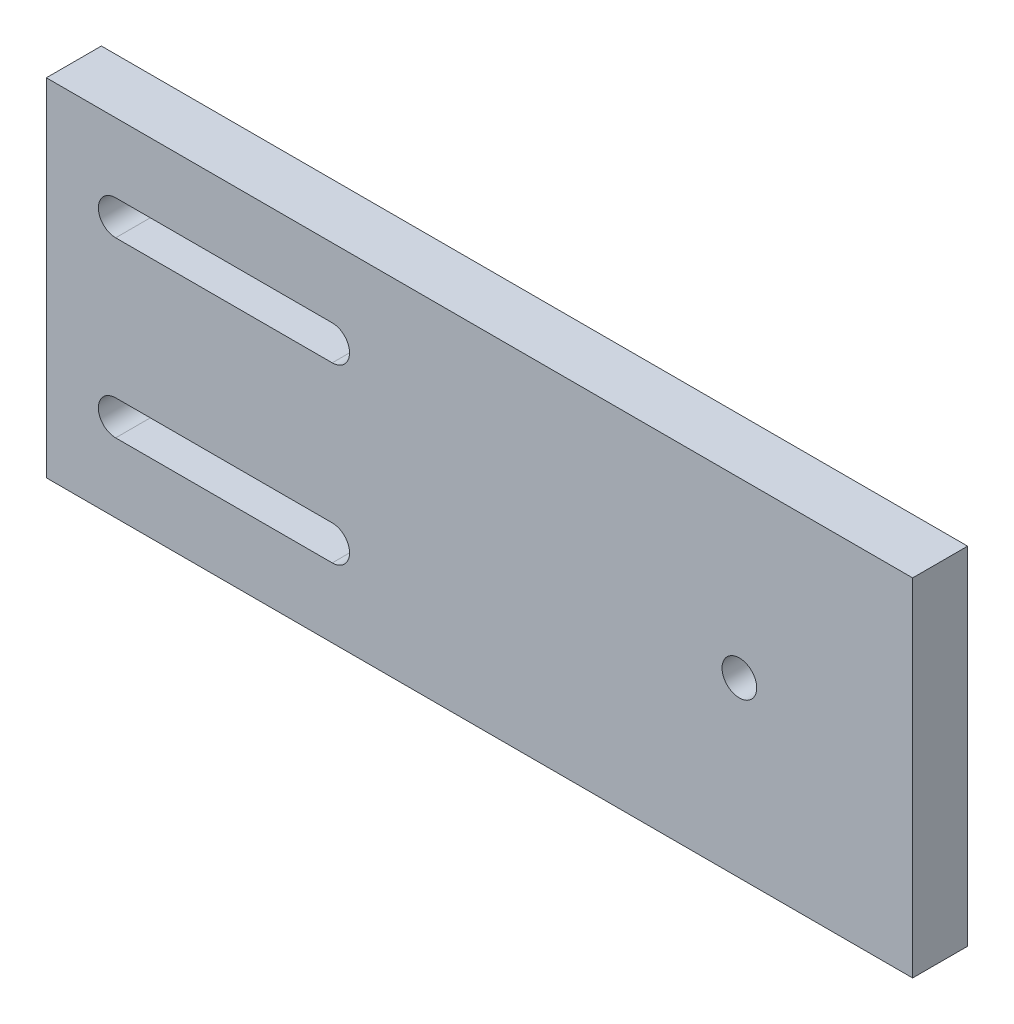
ISO-10303-21;
HEADER;
FILE_DESCRIPTION(('STEP AP214'),'2;1');
FILE_NAME('part.step','',(''),(''),'','','');
FILE_SCHEMA(('AUTOMOTIVE_DESIGN { 1 0 10303 214 1 1 1 1 }'));
ENDSEC;
DATA;
#1=APPLICATION_CONTEXT('core data for automotive mechanical design processes');
#2=APPLICATION_PROTOCOL_DEFINITION('international standard','automotive_design',2000,#1);
#3=PRODUCT_CONTEXT('',#1,'mechanical');
#4=PRODUCT('Part','Part','',(#3));
#5=PRODUCT_RELATED_PRODUCT_CATEGORY('part','',(#4));
#6=PRODUCT_DEFINITION_FORMATION('','',#4);
#7=PRODUCT_DEFINITION_CONTEXT('part definition',#1,'design');
#8=PRODUCT_DEFINITION('design','',#6,#7);
#9=PRODUCT_DEFINITION_SHAPE('','',#8);
#10=(LENGTH_UNIT() NAMED_UNIT(*) SI_UNIT(.MILLI.,.METRE.));
#11=(NAMED_UNIT(*) PLANE_ANGLE_UNIT() SI_UNIT($,.RADIAN.));
#12=(NAMED_UNIT(*) SI_UNIT($,.STERADIAN.) SOLID_ANGLE_UNIT());
#13=UNCERTAINTY_MEASURE_WITH_UNIT(LENGTH_MEASURE(1.E-05),#10,'distance_accuracy_value','');
#14=(GEOMETRIC_REPRESENTATION_CONTEXT(3) GLOBAL_UNCERTAINTY_ASSIGNED_CONTEXT((#13)) GLOBAL_UNIT_ASSIGNED_CONTEXT((#10,
#11,#12)) REPRESENTATION_CONTEXT('',''));
#15=CARTESIAN_POINT('',(0.,0.,0.));
#16=DIRECTION('',(0.,0.,1.));
#17=DIRECTION('',(1.,0.,0.));
#18=AXIS2_PLACEMENT_3D('',#15,#16,#17);
#19=CARTESIAN_POINT('',(0.,0.,6.35));
#20=DIRECTION('',(0.,0.,-1.));
#21=DIRECTION('',(-1.,0.,0.));
#22=AXIS2_PLACEMENT_3D('',#19,#20,#21);
#23=PLANE('',#22);
#24=CARTESIAN_POINT('',(8.,30.,6.35));
#25=DIRECTION('',(0.,0.,1.));
#26=DIRECTION('',(1.,0.,0.));
#27=AXIS2_PLACEMENT_3D('',#24,#25,#26);
#28=CIRCLE('',#27,2.);
#29=CARTESIAN_POINT('',(8.,32.,6.35));
#30=VERTEX_POINT('',#29);
#31=CARTESIAN_POINT('',(8.,28.,6.35));
#32=VERTEX_POINT('',#31);
#33=EDGE_CURVE('E165',#30,#32,#28,.T.);
#34=ORIENTED_EDGE('',*,*,#33,.F.);
#35=DIRECTION('',(-1.,0.,0.));
#36=VECTOR('',#35,1.);
#37=CARTESIAN_POINT('',(8.,32.,6.35));
#38=LINE('',#37,#36);
#39=CARTESIAN_POINT('',(33.,32.,6.35));
#40=VERTEX_POINT('',#39);
#41=EDGE_CURVE('E173',#40,#30,#38,.T.);
#42=ORIENTED_EDGE('',*,*,#41,.F.);
#43=CARTESIAN_POINT('',(33.,30.,6.35));
#44=DIRECTION('',(0.,0.,1.));
#45=DIRECTION('',(-1.,0.,0.));
#46=AXIS2_PLACEMENT_3D('',#43,#44,#45);
#47=CIRCLE('',#46,2.);
#48=CARTESIAN_POINT('',(33.,28.,6.35));
#49=VERTEX_POINT('',#48);
#50=EDGE_CURVE('E170',#49,#40,#47,.T.);
#51=ORIENTED_EDGE('',*,*,#50,.F.);
#52=DIRECTION('',(1.,0.,0.));
#53=VECTOR('',#52,1.);
#54=CARTESIAN_POINT('',(8.,28.,6.35));
#55=LINE('',#54,#53);
#56=EDGE_CURVE('E167',#32,#49,#55,.T.);
#57=ORIENTED_EDGE('',*,*,#56,.F.);
#58=EDGE_LOOP('',(#34,#42,#51,#57));
#59=FACE_BOUND('',#58,.T.);
#60=DIRECTION('',(0.,-1.,0.));
#61=VECTOR('',#60,1.);
#62=CARTESIAN_POINT('',(0.,0.,6.35));
#63=LINE('',#62,#61);
#64=CARTESIAN_POINT('',(0.,40.,6.35));
#65=VERTEX_POINT('',#64);
#66=CARTESIAN_POINT('',(0.,0.,6.35));
#67=VERTEX_POINT('',#66);
#68=EDGE_CURVE('E196',#65,#67,#63,.T.);
#69=ORIENTED_EDGE('',*,*,#68,.T.);
#70=DIRECTION('',(1.,0.,0.));
#71=VECTOR('',#70,1.);
#72=CARTESIAN_POINT('',(0.,0.,6.35));
#73=LINE('',#72,#71);
#74=CARTESIAN_POINT('',(100.,0.,6.35));
#75=VERTEX_POINT('',#74);
#76=EDGE_CURVE('E199',#67,#75,#73,.T.);
#77=ORIENTED_EDGE('',*,*,#76,.T.);
#78=DIRECTION('',(0.,1.,0.));
#79=VECTOR('',#78,1.);
#80=CARTESIAN_POINT('',(100.,0.,6.35));
#81=LINE('',#80,#79);
#82=CARTESIAN_POINT('',(100.,40.,6.35));
#83=VERTEX_POINT('',#82);
#84=EDGE_CURVE('E202',#75,#83,#81,.T.);
#85=ORIENTED_EDGE('',*,*,#84,.T.);
#86=DIRECTION('',(-1.,0.,0.));
#87=VECTOR('',#86,1.);
#88=CARTESIAN_POINT('',(0.,40.,6.35));
#89=LINE('',#88,#87);
#90=EDGE_CURVE('E204',#83,#65,#89,.T.);
#91=ORIENTED_EDGE('',*,*,#90,.T.);
#92=EDGE_LOOP('',(#69,#77,#85,#91));
#93=FACE_BOUND('',#92,.T.);
#94=CARTESIAN_POINT('',(8.,10.,6.35));
#95=DIRECTION('',(0.,0.,1.));
#96=DIRECTION('',(1.,0.,0.));
#97=AXIS2_PLACEMENT_3D('',#94,#95,#96);
#98=CIRCLE('',#97,2.);
#99=CARTESIAN_POINT('',(8.,12.,6.35));
#100=VERTEX_POINT('',#99);
#101=CARTESIAN_POINT('',(8.,8.,6.35));
#102=VERTEX_POINT('',#101);
#103=EDGE_CURVE('E126',#100,#102,#98,.T.);
#104=ORIENTED_EDGE('',*,*,#103,.F.);
#105=DIRECTION('',(-1.,0.,0.));
#106=VECTOR('',#105,1.);
#107=CARTESIAN_POINT('',(8.,12.,6.35));
#108=LINE('',#107,#106);
#109=CARTESIAN_POINT('',(33.,12.,6.35));
#110=VERTEX_POINT('',#109);
#111=EDGE_CURVE('E149',#110,#100,#108,.T.);
#112=ORIENTED_EDGE('',*,*,#111,.F.);
#113=CARTESIAN_POINT('',(33.,10.,6.35));
#114=DIRECTION('',(0.,0.,1.));
#115=DIRECTION('',(-1.,0.,0.));
#116=AXIS2_PLACEMENT_3D('',#113,#114,#115);
#117=CIRCLE('',#116,2.);
#118=CARTESIAN_POINT('',(33.,8.,6.35));
#119=VERTEX_POINT('',#118);
#120=EDGE_CURVE('E147',#119,#110,#117,.T.);
#121=ORIENTED_EDGE('',*,*,#120,.F.);
#122=DIRECTION('',(1.,0.,0.));
#123=VECTOR('',#122,1.);
#124=CARTESIAN_POINT('',(8.,8.,6.35));
#125=LINE('',#124,#123);
#126=EDGE_CURVE('E134',#102,#119,#125,.T.);
#127=ORIENTED_EDGE('',*,*,#126,.F.);
#128=EDGE_LOOP('',(#104,#112,#121,#127));
#129=FACE_BOUND('',#128,.T.);
#130=CARTESIAN_POINT('',(80.,20.,6.35));
#131=DIRECTION('',(0.,0.,1.));
#132=DIRECTION('',(1.,0.,0.));
#133=AXIS2_PLACEMENT_3D('',#130,#131,#132);
#134=CIRCLE('',#133,2.);
#135=CARTESIAN_POINT('',(82.,20.,6.35));
#136=VERTEX_POINT('',#135);
#137=EDGE_CURVE('E155',#136,#136,#134,.T.);
#138=ORIENTED_EDGE('',*,*,#137,.F.);
#139=EDGE_LOOP('',(#138));
#140=FACE_BOUND('',#139,.T.);
#141=ADVANCED_FACE('F37',(#59,#93,#129,#140),#23,.F.);
#142=CARTESIAN_POINT('',(0.,0.,0.));
#143=DIRECTION('',(0.,0.,-1.));
#144=DIRECTION('',(-1.,0.,0.));
#145=AXIS2_PLACEMENT_3D('',#142,#143,#144);
#146=PLANE('',#145);
#147=DIRECTION('',(-1.,0.,0.));
#148=VECTOR('',#147,1.);
#149=CARTESIAN_POINT('',(8.,12.,0.));
#150=LINE('',#149,#148);
#151=CARTESIAN_POINT('',(33.,12.,0.));
#152=VERTEX_POINT('',#151);
#153=CARTESIAN_POINT('',(8.,12.,0.));
#154=VERTEX_POINT('',#153);
#155=EDGE_CURVE('E135',#152,#154,#150,.T.);
#156=ORIENTED_EDGE('',*,*,#155,.T.);
#157=CARTESIAN_POINT('',(8.,10.,0.));
#158=DIRECTION('',(0.,0.,1.));
#159=DIRECTION('',(1.,0.,0.));
#160=AXIS2_PLACEMENT_3D('',#157,#158,#159);
#161=CIRCLE('',#160,2.);
#162=CARTESIAN_POINT('',(8.,8.,0.));
#163=VERTEX_POINT('',#162);
#164=EDGE_CURVE('E60',#154,#163,#161,.T.);
#165=ORIENTED_EDGE('',*,*,#164,.T.);
#166=DIRECTION('',(1.,0.,0.));
#167=VECTOR('',#166,1.);
#168=CARTESIAN_POINT('',(8.,8.,0.));
#169=LINE('',#168,#167);
#170=CARTESIAN_POINT('',(33.,8.,0.));
#171=VERTEX_POINT('',#170);
#172=EDGE_CURVE('E141',#163,#171,#169,.T.);
#173=ORIENTED_EDGE('',*,*,#172,.T.);
#174=CARTESIAN_POINT('',(33.,10.,0.));
#175=DIRECTION('',(0.,0.,1.));
#176=DIRECTION('',(-1.,0.,0.));
#177=AXIS2_PLACEMENT_3D('',#174,#175,#176);
#178=CIRCLE('',#177,2.);
#179=EDGE_CURVE('E157',#171,#152,#178,.T.);
#180=ORIENTED_EDGE('',*,*,#179,.T.);
#181=EDGE_LOOP('',(#156,#165,#173,#180));
#182=FACE_BOUND('',#181,.T.);
#183=DIRECTION('',(-1.,0.,0.));
#184=VECTOR('',#183,1.);
#185=CARTESIAN_POINT('',(8.,32.,0.));
#186=LINE('',#185,#184);
#187=CARTESIAN_POINT('',(33.,32.,0.));
#188=VERTEX_POINT('',#187);
#189=CARTESIAN_POINT('',(8.,32.,0.));
#190=VERTEX_POINT('',#189);
#191=EDGE_CURVE('E168',#188,#190,#186,.T.);
#192=ORIENTED_EDGE('',*,*,#191,.T.);
#193=CARTESIAN_POINT('',(8.,30.,0.));
#194=DIRECTION('',(0.,0.,1.));
#195=DIRECTION('',(1.,0.,0.));
#196=AXIS2_PLACEMENT_3D('',#193,#194,#195);
#197=CIRCLE('',#196,2.);
#198=CARTESIAN_POINT('',(8.,28.,0.));
#199=VERTEX_POINT('',#198);
#200=EDGE_CURVE('E142',#190,#199,#197,.T.);
#201=ORIENTED_EDGE('',*,*,#200,.T.);
#202=DIRECTION('',(1.,0.,0.));
#203=VECTOR('',#202,1.);
#204=CARTESIAN_POINT('',(8.,28.,0.));
#205=LINE('',#204,#203);
#206=CARTESIAN_POINT('',(33.,28.,0.));
#207=VERTEX_POINT('',#206);
#208=EDGE_CURVE('E178',#199,#207,#205,.T.);
#209=ORIENTED_EDGE('',*,*,#208,.T.);
#210=CARTESIAN_POINT('',(33.,30.,0.));
#211=DIRECTION('',(0.,0.,1.));
#212=DIRECTION('',(-1.,0.,0.));
#213=AXIS2_PLACEMENT_3D('',#210,#211,#212);
#214=CIRCLE('',#213,2.);
#215=EDGE_CURVE('E181',#207,#188,#214,.T.);
#216=ORIENTED_EDGE('',*,*,#215,.T.);
#217=EDGE_LOOP('',(#192,#201,#209,#216));
#218=FACE_BOUND('',#217,.T.);
#219=DIRECTION('',(0.,-1.,0.));
#220=VECTOR('',#219,1.);
#221=CARTESIAN_POINT('',(0.,0.,0.));
#222=LINE('',#221,#220);
#223=CARTESIAN_POINT('',(0.,40.,0.));
#224=VERTEX_POINT('',#223);
#225=CARTESIAN_POINT('',(0.,0.,0.));
#226=VERTEX_POINT('',#225);
#227=EDGE_CURVE('E195',#224,#226,#222,.T.);
#228=ORIENTED_EDGE('',*,*,#227,.F.);
#229=DIRECTION('',(-1.,0.,0.));
#230=VECTOR('',#229,1.);
#231=CARTESIAN_POINT('',(0.,40.,0.));
#232=LINE('',#231,#230);
#233=CARTESIAN_POINT('',(100.,40.,0.));
#234=VERTEX_POINT('',#233);
#235=EDGE_CURVE('E200',#234,#224,#232,.T.);
#236=ORIENTED_EDGE('',*,*,#235,.F.);
#237=DIRECTION('',(0.,1.,0.));
#238=VECTOR('',#237,1.);
#239=CARTESIAN_POINT('',(100.,0.,0.));
#240=LINE('',#239,#238);
#241=CARTESIAN_POINT('',(100.,0.,0.));
#242=VERTEX_POINT('',#241);
#243=EDGE_CURVE('E211',#242,#234,#240,.T.);
#244=ORIENTED_EDGE('',*,*,#243,.F.);
#245=DIRECTION('',(1.,0.,0.));
#246=VECTOR('',#245,1.);
#247=CARTESIAN_POINT('',(0.,0.,0.));
#248=LINE('',#247,#246);
#249=EDGE_CURVE('E209',#226,#242,#248,.T.);
#250=ORIENTED_EDGE('',*,*,#249,.F.);
#251=EDGE_LOOP('',(#228,#236,#244,#250));
#252=FACE_BOUND('',#251,.T.);
#253=CARTESIAN_POINT('',(80.,20.,0.));
#254=DIRECTION('',(0.,0.,1.));
#255=DIRECTION('',(1.,0.,0.));
#256=AXIS2_PLACEMENT_3D('',#253,#254,#255);
#257=CIRCLE('',#256,2.);
#258=CARTESIAN_POINT('',(82.,20.,0.));
#259=VERTEX_POINT('',#258);
#260=EDGE_CURVE('E310',#259,#259,#257,.T.);
#261=ORIENTED_EDGE('',*,*,#260,.T.);
#262=EDGE_LOOP('',(#261));
#263=FACE_BOUND('',#262,.T.);
#264=ADVANCED_FACE('F229',(#182,#218,#252,#263),#146,.T.);
#265=CARTESIAN_POINT('',(0.,0.,6.35));
#266=DIRECTION('',(1.,0.,0.));
#267=DIRECTION('',(0.,0.,-1.));
#268=AXIS2_PLACEMENT_3D('',#265,#266,#267);
#269=PLANE('',#268);
#270=ORIENTED_EDGE('',*,*,#227,.T.);
#271=DIRECTION('',(0.,0.,-1.));
#272=VECTOR('',#271,1.);
#273=CARTESIAN_POINT('',(0.,0.,6.35));
#274=LINE('',#273,#272);
#275=EDGE_CURVE('E11',#67,#226,#274,.T.);
#276=ORIENTED_EDGE('',*,*,#275,.F.);
#277=ORIENTED_EDGE('',*,*,#68,.F.);
#278=DIRECTION('',(0.,0.,-1.));
#279=VECTOR('',#278,1.);
#280=CARTESIAN_POINT('',(0.,40.,6.35));
#281=LINE('',#280,#279);
#282=EDGE_CURVE('E206',#65,#224,#281,.T.);
#283=ORIENTED_EDGE('',*,*,#282,.T.);
#284=EDGE_LOOP('',(#270,#276,#277,#283));
#285=FACE_BOUND('',#284,.T.);
#286=ADVANCED_FACE('F39',(#285),#269,.F.);
#287=CARTESIAN_POINT('',(0.,0.,6.35));
#288=DIRECTION('',(0.,1.,0.));
#289=DIRECTION('',(-1.,0.,0.));
#290=AXIS2_PLACEMENT_3D('',#287,#288,#289);
#291=PLANE('',#290);
#292=ORIENTED_EDGE('',*,*,#249,.T.);
#293=DIRECTION('',(0.,0.,-1.));
#294=VECTOR('',#293,1.);
#295=CARTESIAN_POINT('',(100.,0.,6.35));
#296=LINE('',#295,#294);
#297=EDGE_CURVE('E45',#75,#242,#296,.T.);
#298=ORIENTED_EDGE('',*,*,#297,.F.);
#299=ORIENTED_EDGE('',*,*,#76,.F.);
#300=ORIENTED_EDGE('',*,*,#275,.T.);
#301=EDGE_LOOP('',(#292,#298,#299,#300));
#302=FACE_BOUND('',#301,.T.);
#303=ADVANCED_FACE('F239',(#302),#291,.F.);
#304=CARTESIAN_POINT('',(100.,0.,6.35));
#305=DIRECTION('',(-1.,0.,0.));
#306=DIRECTION('',(0.,-1.,0.));
#307=AXIS2_PLACEMENT_3D('',#304,#305,#306);
#308=PLANE('',#307);
#309=ORIENTED_EDGE('',*,*,#243,.T.);
#310=DIRECTION('',(0.,0.,-1.));
#311=VECTOR('',#310,1.);
#312=CARTESIAN_POINT('',(100.,40.,6.35));
#313=LINE('',#312,#311);
#314=EDGE_CURVE('E216',#83,#234,#313,.T.);
#315=ORIENTED_EDGE('',*,*,#314,.F.);
#316=ORIENTED_EDGE('',*,*,#84,.F.);
#317=ORIENTED_EDGE('',*,*,#297,.T.);
#318=EDGE_LOOP('',(#309,#315,#316,#317));
#319=FACE_BOUND('',#318,.T.);
#320=ADVANCED_FACE('F223',(#319),#308,.F.);
#321=CARTESIAN_POINT('',(0.,40.,6.35));
#322=DIRECTION('',(0.,-1.,0.));
#323=DIRECTION('',(1.,0.,0.));
#324=AXIS2_PLACEMENT_3D('',#321,#322,#323);
#325=PLANE('',#324);
#326=ORIENTED_EDGE('',*,*,#235,.T.);
#327=ORIENTED_EDGE('',*,*,#282,.F.);
#328=ORIENTED_EDGE('',*,*,#90,.F.);
#329=ORIENTED_EDGE('',*,*,#314,.T.);
#330=EDGE_LOOP('',(#326,#327,#328,#329));
#331=FACE_BOUND('',#330,.T.);
#332=ADVANCED_FACE('F233',(#331),#325,.F.);
#333=CARTESIAN_POINT('',(8.,30.,6.35));
#334=DIRECTION('',(0.,0.,-1.));
#335=DIRECTION('',(-1.,0.,0.));
#336=AXIS2_PLACEMENT_3D('',#333,#334,#335);
#337=CYLINDRICAL_SURFACE('',#336,2.);
#338=ORIENTED_EDGE('',*,*,#200,.F.);
#339=DIRECTION('',(0.,0.,-1.));
#340=VECTOR('',#339,1.);
#341=CARTESIAN_POINT('',(8.,32.,6.35));
#342=LINE('',#341,#340);
#343=EDGE_CURVE('E175',#30,#190,#342,.T.);
#344=ORIENTED_EDGE('',*,*,#343,.F.);
#345=ORIENTED_EDGE('',*,*,#33,.T.);
#346=DIRECTION('',(0.,0.,-1.));
#347=VECTOR('',#346,1.);
#348=CARTESIAN_POINT('',(8.,28.,6.35));
#349=LINE('',#348,#347);
#350=EDGE_CURVE('E192',#32,#199,#349,.T.);
#351=ORIENTED_EDGE('',*,*,#350,.T.);
#352=EDGE_LOOP('',(#338,#344,#345,#351));
#353=FACE_BOUND('',#352,.T.);
#354=ADVANCED_FACE('F256',(#353),#337,.F.);
#355=CARTESIAN_POINT('',(8.,28.,6.35));
#356=DIRECTION('',(0.,1.,0.));
#357=DIRECTION('',(-1.,0.,0.));
#358=AXIS2_PLACEMENT_3D('',#355,#356,#357);
#359=PLANE('',#358);
#360=ORIENTED_EDGE('',*,*,#208,.F.);
#361=ORIENTED_EDGE('',*,*,#350,.F.);
#362=ORIENTED_EDGE('',*,*,#56,.T.);
#363=DIRECTION('',(0.,0.,-1.));
#364=VECTOR('',#363,1.);
#365=CARTESIAN_POINT('',(33.,28.,6.35));
#366=LINE('',#365,#364);
#367=EDGE_CURVE('E190',#49,#207,#366,.T.);
#368=ORIENTED_EDGE('',*,*,#367,.T.);
#369=EDGE_LOOP('',(#360,#361,#362,#368));
#370=FACE_BOUND('',#369,.T.);
#371=ADVANCED_FACE('F263',(#370),#359,.T.);
#372=CARTESIAN_POINT('',(33.,30.,6.35));
#373=DIRECTION('',(0.,0.,-1.));
#374=DIRECTION('',(-1.,0.,0.));
#375=AXIS2_PLACEMENT_3D('',#372,#373,#374);
#376=CYLINDRICAL_SURFACE('',#375,2.);
#377=ORIENTED_EDGE('',*,*,#215,.F.);
#378=ORIENTED_EDGE('',*,*,#367,.F.);
#379=ORIENTED_EDGE('',*,*,#50,.T.);
#380=DIRECTION('',(0.,0.,-1.));
#381=VECTOR('',#380,1.);
#382=CARTESIAN_POINT('',(33.,32.,6.35));
#383=LINE('',#382,#381);
#384=EDGE_CURVE('E188',#40,#188,#383,.T.);
#385=ORIENTED_EDGE('',*,*,#384,.T.);
#386=EDGE_LOOP('',(#377,#378,#379,#385));
#387=FACE_BOUND('',#386,.T.);
#388=ADVANCED_FACE('F268',(#387),#376,.F.);
#389=CARTESIAN_POINT('',(8.,32.,6.35));
#390=DIRECTION('',(0.,-1.,0.));
#391=DIRECTION('',(0.,0.,-1.));
#392=AXIS2_PLACEMENT_3D('',#389,#390,#391);
#393=PLANE('',#392);
#394=ORIENTED_EDGE('',*,*,#191,.F.);
#395=ORIENTED_EDGE('',*,*,#384,.F.);
#396=ORIENTED_EDGE('',*,*,#41,.T.);
#397=ORIENTED_EDGE('',*,*,#343,.T.);
#398=EDGE_LOOP('',(#394,#395,#396,#397));
#399=FACE_BOUND('',#398,.T.);
#400=ADVANCED_FACE('F275',(#399),#393,.T.);
#401=CARTESIAN_POINT('',(8.,10.,6.35));
#402=DIRECTION('',(0.,0.,-1.));
#403=DIRECTION('',(-1.,0.,0.));
#404=AXIS2_PLACEMENT_3D('',#401,#402,#403);
#405=CYLINDRICAL_SURFACE('',#404,2.);
#406=ORIENTED_EDGE('',*,*,#164,.F.);
#407=DIRECTION('',(0.,0.,-1.));
#408=VECTOR('',#407,1.);
#409=CARTESIAN_POINT('',(8.,12.,6.35));
#410=LINE('',#409,#408);
#411=EDGE_CURVE('E130',#100,#154,#410,.T.);
#412=ORIENTED_EDGE('',*,*,#411,.F.);
#413=ORIENTED_EDGE('',*,*,#103,.T.);
#414=DIRECTION('',(0.,0.,-1.));
#415=VECTOR('',#414,1.);
#416=CARTESIAN_POINT('',(8.,8.,6.35));
#417=LINE('',#416,#415);
#418=EDGE_CURVE('E129',#102,#163,#417,.T.);
#419=ORIENTED_EDGE('',*,*,#418,.T.);
#420=EDGE_LOOP('',(#406,#412,#413,#419));
#421=FACE_BOUND('',#420,.T.);
#422=ADVANCED_FACE('F128',(#421),#405,.F.);
#423=CARTESIAN_POINT('',(8.,8.,6.35));
#424=DIRECTION('',(0.,1.,0.));
#425=DIRECTION('',(-1.,0.,0.));
#426=AXIS2_PLACEMENT_3D('',#423,#424,#425);
#427=PLANE('',#426);
#428=ORIENTED_EDGE('',*,*,#172,.F.);
#429=ORIENTED_EDGE('',*,*,#418,.F.);
#430=ORIENTED_EDGE('',*,*,#126,.T.);
#431=DIRECTION('',(0.,0.,-1.));
#432=VECTOR('',#431,1.);
#433=CARTESIAN_POINT('',(33.,8.,6.35));
#434=LINE('',#433,#432);
#435=EDGE_CURVE('E143',#119,#171,#434,.T.);
#436=ORIENTED_EDGE('',*,*,#435,.T.);
#437=EDGE_LOOP('',(#428,#429,#430,#436));
#438=FACE_BOUND('',#437,.T.);
#439=ADVANCED_FACE('F138',(#438),#427,.T.);
#440=CARTESIAN_POINT('',(33.,10.,6.35));
#441=DIRECTION('',(0.,0.,-1.));
#442=DIRECTION('',(-1.,0.,0.));
#443=AXIS2_PLACEMENT_3D('',#440,#441,#442);
#444=CYLINDRICAL_SURFACE('',#443,2.);
#445=ORIENTED_EDGE('',*,*,#179,.F.);
#446=ORIENTED_EDGE('',*,*,#435,.F.);
#447=ORIENTED_EDGE('',*,*,#120,.T.);
#448=DIRECTION('',(0.,0.,-1.));
#449=VECTOR('',#448,1.);
#450=CARTESIAN_POINT('',(33.,12.,6.35));
#451=LINE('',#450,#449);
#452=EDGE_CURVE('E52',#110,#152,#451,.T.);
#453=ORIENTED_EDGE('',*,*,#452,.T.);
#454=EDGE_LOOP('',(#445,#446,#447,#453));
#455=FACE_BOUND('',#454,.T.);
#456=ADVANCED_FACE('F293',(#455),#444,.F.);
#457=CARTESIAN_POINT('',(8.,12.,6.35));
#458=DIRECTION('',(0.,-1.,0.));
#459=DIRECTION('',(1.,0.,0.));
#460=AXIS2_PLACEMENT_3D('',#457,#458,#459);
#461=PLANE('',#460);
#462=ORIENTED_EDGE('',*,*,#155,.F.);
#463=ORIENTED_EDGE('',*,*,#452,.F.);
#464=ORIENTED_EDGE('',*,*,#111,.T.);
#465=ORIENTED_EDGE('',*,*,#411,.T.);
#466=EDGE_LOOP('',(#462,#463,#464,#465));
#467=FACE_BOUND('',#466,.T.);
#468=ADVANCED_FACE('F296',(#467),#461,.T.);
#469=CARTESIAN_POINT('',(80.,20.,6.35));
#470=DIRECTION('',(0.,0.,-1.));
#471=DIRECTION('',(-1.,0.,0.));
#472=AXIS2_PLACEMENT_3D('',#469,#470,#471);
#473=CYLINDRICAL_SURFACE('',#472,2.);
#474=ORIENTED_EDGE('',*,*,#137,.T.);
#475=EDGE_LOOP('',(#474));
#476=FACE_BOUND('',#475,.T.);
#477=ORIENTED_EDGE('',*,*,#260,.F.);
#478=EDGE_LOOP('',(#477));
#479=FACE_BOUND('',#478,.T.);
#480=ADVANCED_FACE('F300',(#476,#479),#473,.F.);
#481=CLOSED_SHELL('',(#141,#264,#286,#303,#320,#332,#354,#371,#388,#400,#422,#439,#456,#468,#480));
#482=MANIFOLD_SOLID_BREP('B2',#481);
#483=ADVANCED_BREP_SHAPE_REPRESENTATION('',(#18,#482),#14);
#484=SHAPE_DEFINITION_REPRESENTATION(#9,#483);
ENDSEC;
END-ISO-10303-21;
